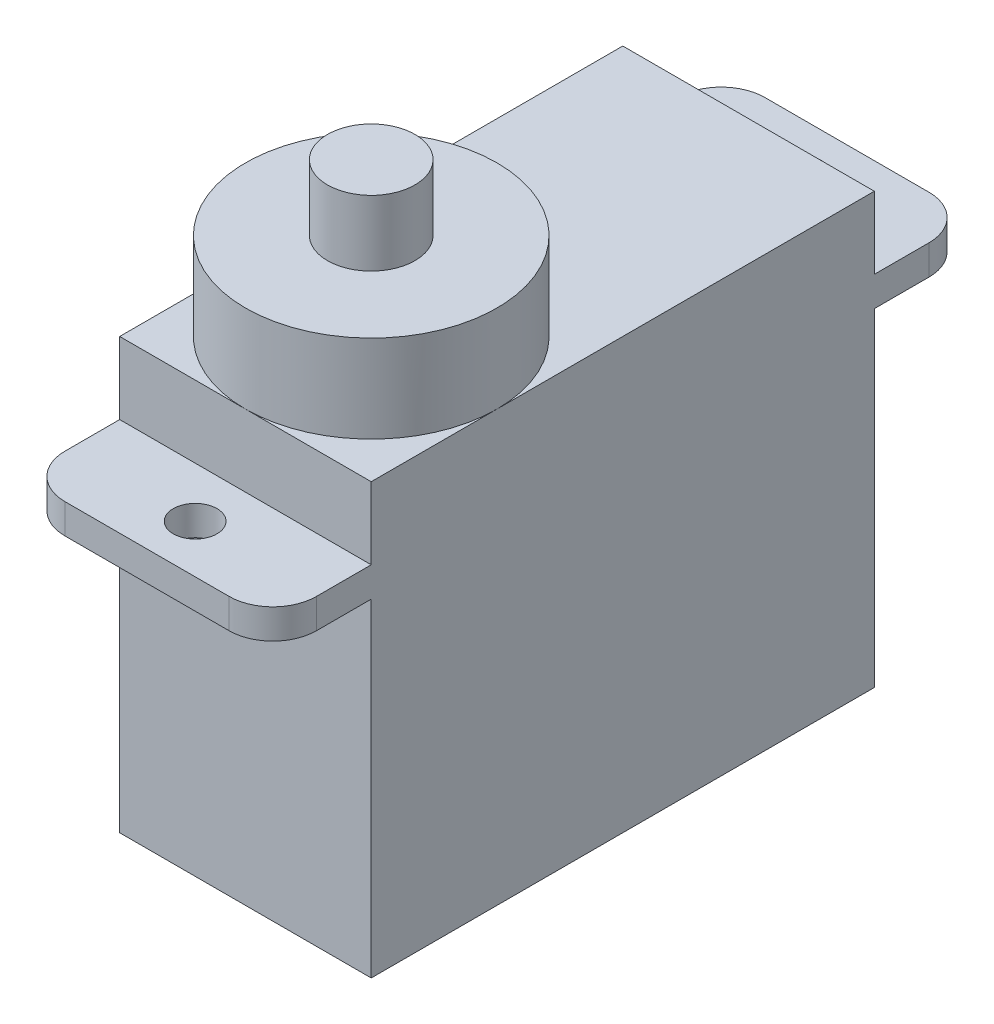
ISO-10303-21;
HEADER;
FILE_DESCRIPTION(('STEP AP214'),'2;1');
FILE_NAME('part.step','',(''),(''),'','','');
FILE_SCHEMA(('AUTOMOTIVE_DESIGN { 1 0 10303 214 1 1 1 1 }'));
ENDSEC;
DATA;
#1=APPLICATION_CONTEXT('core data for automotive mechanical design processes');
#2=APPLICATION_PROTOCOL_DEFINITION('international standard','automotive_design',2000,#1);
#3=PRODUCT_CONTEXT('',#1,'mechanical');
#4=PRODUCT('Part','Part','',(#3));
#5=PRODUCT_RELATED_PRODUCT_CATEGORY('part','',(#4));
#6=PRODUCT_DEFINITION_FORMATION('','',#4);
#7=PRODUCT_DEFINITION_CONTEXT('part definition',#1,'design');
#8=PRODUCT_DEFINITION('design','',#6,#7);
#9=PRODUCT_DEFINITION_SHAPE('','',#8);
#10=(LENGTH_UNIT() NAMED_UNIT(*) SI_UNIT(.MILLI.,.METRE.));
#11=(NAMED_UNIT(*) PLANE_ANGLE_UNIT() SI_UNIT($,.RADIAN.));
#12=(NAMED_UNIT(*) SI_UNIT($,.STERADIAN.) SOLID_ANGLE_UNIT());
#13=UNCERTAINTY_MEASURE_WITH_UNIT(LENGTH_MEASURE(1.E-05),#10,'distance_accuracy_value','');
#14=(GEOMETRIC_REPRESENTATION_CONTEXT(3) GLOBAL_UNCERTAINTY_ASSIGNED_CONTEXT((#13)) GLOBAL_UNIT_ASSIGNED_CONTEXT((#10,
#11,#12)) REPRESENTATION_CONTEXT('',''));
#15=CARTESIAN_POINT('',(0.,0.,0.));
#16=DIRECTION('',(0.,0.,1.));
#17=DIRECTION('',(1.,0.,0.));
#18=AXIS2_PLACEMENT_3D('',#15,#16,#17);
#19=CARTESIAN_POINT('',(0.,23.65,5.75));
#20=DIRECTION('',(0.,1.,0.));
#21=DIRECTION('',(0.,0.,1.));
#22=AXIS2_PLACEMENT_3D('',#19,#20,#21);
#23=PLANE('',#22);
#24=CARTESIAN_POINT('',(0.,23.65,5.75));
#25=DIRECTION('',(0.,1.,0.));
#26=DIRECTION('',(0.,0.,1.));
#27=AXIS2_PLACEMENT_3D('',#24,#25,#26);
#28=CIRCLE('',#27,5.75);
#29=CARTESIAN_POINT('',(0.,23.65,11.5));
#30=VERTEX_POINT('',#29);
#31=EDGE_CURVE('E180',#30,#30,#28,.T.);
#32=ORIENTED_EDGE('',*,*,#31,.T.);
#33=EDGE_LOOP('',(#32));
#34=FACE_BOUND('',#33,.T.);
#35=CARTESIAN_POINT('',(0.,23.65,5.75));
#36=DIRECTION('',(0.,1.,0.));
#37=DIRECTION('',(0.,0.,1.));
#38=AXIS2_PLACEMENT_3D('',#35,#36,#37);
#39=CIRCLE('',#38,2.);
#40=CARTESIAN_POINT('',(0.,23.65,7.75));
#41=VERTEX_POINT('',#40);
#42=EDGE_CURVE('E594',#41,#41,#39,.T.);
#43=ORIENTED_EDGE('',*,*,#42,.F.);
#44=EDGE_LOOP('',(#43));
#45=FACE_BOUND('',#44,.T.);
#46=ADVANCED_FACE('F36',(#34,#45),#23,.T.);
#47=CARTESIAN_POINT('',(0.,19.65,0.));
#48=DIRECTION('',(0.,1.,0.));
#49=DIRECTION('',(0.,0.,1.));
#50=AXIS2_PLACEMENT_3D('',#47,#48,#49);
#51=PLANE('',#50);
#52=CARTESIAN_POINT('',(0.,19.65,5.75));
#53=DIRECTION('',(0.,1.,0.));
#54=DIRECTION('',(0.,0.,1.));
#55=AXIS2_PLACEMENT_3D('',#52,#53,#54);
#56=CIRCLE('',#55,5.75);
#57=CARTESIAN_POINT('',(0.,19.65,11.5));
#58=VERTEX_POINT('',#57);
#59=CARTESIAN_POINT('',(5.75,19.65,5.75));
#60=VERTEX_POINT('',#59);
#61=EDGE_CURVE('E47',#58,#60,#56,.T.);
#62=ORIENTED_EDGE('',*,*,#61,.F.);
#63=DIRECTION('',(1.,0.,0.));
#64=VECTOR('',#63,1.);
#65=CARTESIAN_POINT('',(-5.75,19.65,11.5));
#66=LINE('',#65,#64);
#67=CARTESIAN_POINT('',(5.75,19.65,11.5));
#68=VERTEX_POINT('',#67);
#69=EDGE_CURVE('E165',#58,#68,#66,.T.);
#70=ORIENTED_EDGE('',*,*,#69,.T.);
#71=DIRECTION('',(0.,0.,-1.));
#72=VECTOR('',#71,1.);
#73=CARTESIAN_POINT('',(5.75,19.65,-11.5));
#74=LINE('',#73,#72);
#75=EDGE_CURVE('E178',#68,#60,#74,.T.);
#76=ORIENTED_EDGE('',*,*,#75,.T.);
#77=EDGE_LOOP('',(#62,#70,#76));
#78=FACE_BOUND('',#77,.T.);
#79=ADVANCED_FACE('F177',(#78),#51,.T.);
#80=CARTESIAN_POINT('',(-5.75,19.65,5.75));
#81=VERTEX_POINT('',#80);
#82=EDGE_CURVE('E11',#60,#81,#56,.T.);
#83=ORIENTED_EDGE('',*,*,#82,.F.);
#84=CARTESIAN_POINT('',(5.75,19.65,-11.5));
#85=VERTEX_POINT('',#84);
#86=EDGE_CURVE('E229',#60,#85,#74,.T.);
#87=ORIENTED_EDGE('',*,*,#86,.T.);
#88=DIRECTION('',(-1.,0.,0.));
#89=VECTOR('',#88,1.);
#90=CARTESIAN_POINT('',(-5.75,19.65,-11.5));
#91=LINE('',#90,#89);
#92=CARTESIAN_POINT('',(-5.75,19.65,-11.5));
#93=VERTEX_POINT('',#92);
#94=EDGE_CURVE('E228',#85,#93,#91,.T.);
#95=ORIENTED_EDGE('',*,*,#94,.T.);
#96=DIRECTION('',(0.,0.,1.));
#97=VECTOR('',#96,1.);
#98=CARTESIAN_POINT('',(-5.75,19.65,-11.5));
#99=LINE('',#98,#97);
#100=EDGE_CURVE('E175',#93,#81,#99,.T.);
#101=ORIENTED_EDGE('',*,*,#100,.T.);
#102=EDGE_LOOP('',(#83,#87,#95,#101));
#103=FACE_BOUND('',#102,.T.);
#104=ADVANCED_FACE('F366',(#103),#51,.T.);
#105=CARTESIAN_POINT('',(-5.75,19.65,-11.5));
#106=DIRECTION('',(0.,0.,1.));
#107=DIRECTION('',(1.,0.,0.));
#108=AXIS2_PLACEMENT_3D('',#105,#106,#107);
#109=PLANE('',#108);
#110=DIRECTION('',(-1.,0.,0.));
#111=VECTOR('',#110,1.);
#112=CARTESIAN_POINT('',(-5.75,15.,-11.5));
#113=LINE('',#112,#111);
#114=CARTESIAN_POINT('',(5.75,15.,-11.5));
#115=VERTEX_POINT('',#114);
#116=CARTESIAN_POINT('',(-5.75,15.,-11.5));
#117=VERTEX_POINT('',#116);
#118=EDGE_CURVE('E210',#115,#117,#113,.T.);
#119=ORIENTED_EDGE('',*,*,#118,.F.);
#120=DIRECTION('',(0.,-1.,0.));
#121=VECTOR('',#120,1.);
#122=CARTESIAN_POINT('',(5.75,19.65,-11.5));
#123=LINE('',#122,#121);
#124=CARTESIAN_POINT('',(5.75,0.,-11.5));
#125=VERTEX_POINT('',#124);
#126=EDGE_CURVE('E251',#115,#125,#123,.T.);
#127=ORIENTED_EDGE('',*,*,#126,.T.);
#128=DIRECTION('',(-1.,0.,0.));
#129=VECTOR('',#128,1.);
#130=CARTESIAN_POINT('',(-5.75,0.,-11.5));
#131=LINE('',#130,#129);
#132=CARTESIAN_POINT('',(-5.75,0.,-11.5));
#133=VERTEX_POINT('',#132);
#134=EDGE_CURVE('E234',#125,#133,#131,.T.);
#135=ORIENTED_EDGE('',*,*,#134,.T.);
#136=DIRECTION('',(0.,-1.,0.));
#137=VECTOR('',#136,1.);
#138=CARTESIAN_POINT('',(-5.75,19.65,-11.5));
#139=LINE('',#138,#137);
#140=EDGE_CURVE('E247',#117,#133,#139,.T.);
#141=ORIENTED_EDGE('',*,*,#140,.F.);
#142=EDGE_LOOP('',(#119,#127,#135,#141));
#143=FACE_BOUND('',#142,.T.);
#144=ADVANCED_FACE('F336',(#143),#109,.F.);
#145=CARTESIAN_POINT('',(-5.75,19.65,11.5));
#146=DIRECTION('',(0.,0.,-1.));
#147=DIRECTION('',(-1.,0.,0.));
#148=AXIS2_PLACEMENT_3D('',#145,#146,#147);
#149=PLANE('',#148);
#150=DIRECTION('',(1.,0.,0.));
#151=VECTOR('',#150,1.);
#152=CARTESIAN_POINT('',(-5.75,15.,11.5));
#153=LINE('',#152,#151);
#154=CARTESIAN_POINT('',(-5.75,15.,11.5));
#155=VERTEX_POINT('',#154);
#156=CARTESIAN_POINT('',(5.75,15.,11.5));
#157=VERTEX_POINT('',#156);
#158=EDGE_CURVE('E255',#155,#157,#153,.T.);
#159=ORIENTED_EDGE('',*,*,#158,.F.);
#160=DIRECTION('',(0.,-1.,0.));
#161=VECTOR('',#160,1.);
#162=CARTESIAN_POINT('',(-5.75,19.65,11.5));
#163=LINE('',#162,#161);
#164=CARTESIAN_POINT('',(-5.75,0.,11.5));
#165=VERTEX_POINT('',#164);
#166=EDGE_CURVE('E244',#155,#165,#163,.T.);
#167=ORIENTED_EDGE('',*,*,#166,.T.);
#168=DIRECTION('',(1.,0.,0.));
#169=VECTOR('',#168,1.);
#170=CARTESIAN_POINT('',(-5.75,0.,11.5));
#171=LINE('',#170,#169);
#172=CARTESIAN_POINT('',(5.75,0.,11.5));
#173=VERTEX_POINT('',#172);
#174=EDGE_CURVE('E240',#165,#173,#171,.T.);
#175=ORIENTED_EDGE('',*,*,#174,.T.);
#176=DIRECTION('',(0.,-1.,0.));
#177=VECTOR('',#176,1.);
#178=CARTESIAN_POINT('',(5.75,19.65,11.5));
#179=LINE('',#178,#177);
#180=EDGE_CURVE('E164',#157,#173,#179,.T.);
#181=ORIENTED_EDGE('',*,*,#180,.F.);
#182=EDGE_LOOP('',(#159,#167,#175,#181));
#183=FACE_BOUND('',#182,.T.);
#184=ADVANCED_FACE('F328',(#183),#149,.F.);
#185=CARTESIAN_POINT('',(5.75,19.65,-11.5));
#186=DIRECTION('',(-1.,0.,0.));
#187=DIRECTION('',(0.,0.,1.));
#188=AXIS2_PLACEMENT_3D('',#185,#186,#187);
#189=PLANE('',#188);
#190=DIRECTION('',(0.,0.,1.));
#191=VECTOR('',#190,1.);
#192=CARTESIAN_POINT('',(5.75,15.,16.));
#193=LINE('',#192,#191);
#194=CARTESIAN_POINT('',(5.75,15.,-14.));
#195=VERTEX_POINT('',#194);
#196=EDGE_CURVE('E217',#195,#115,#193,.T.);
#197=ORIENTED_EDGE('',*,*,#196,.F.);
#198=DIRECTION('',(0.,-1.,0.));
#199=VECTOR('',#198,1.);
#200=CARTESIAN_POINT('',(5.75,16.36,-14.));
#201=LINE('',#200,#199);
#202=CARTESIAN_POINT('',(5.75,16.36,-14.));
#203=VERTEX_POINT('',#202);
#204=EDGE_CURVE('E283',#195,#203,#201,.F.);
#205=ORIENTED_EDGE('',*,*,#204,.T.);
#206=DIRECTION('',(0.,0.,1.));
#207=VECTOR('',#206,1.);
#208=CARTESIAN_POINT('',(5.75,16.36,16.));
#209=LINE('',#208,#207);
#210=CARTESIAN_POINT('',(5.75,16.36,-11.5));
#211=VERTEX_POINT('',#210);
#212=EDGE_CURVE('E205',#203,#211,#209,.T.);
#213=ORIENTED_EDGE('',*,*,#212,.T.);
#214=EDGE_CURVE('E252',#85,#211,#123,.T.);
#215=ORIENTED_EDGE('',*,*,#214,.F.);
#216=ORIENTED_EDGE('',*,*,#86,.F.);
#217=ORIENTED_EDGE('',*,*,#75,.F.);
#218=CARTESIAN_POINT('',(5.75,16.36,11.5));
#219=VERTEX_POINT('',#218);
#220=EDGE_CURVE('E171',#68,#219,#179,.T.);
#221=ORIENTED_EDGE('',*,*,#220,.T.);
#222=CARTESIAN_POINT('',(5.75,16.36,14.));
#223=VERTEX_POINT('',#222);
#224=EDGE_CURVE('E204',#219,#223,#209,.T.);
#225=ORIENTED_EDGE('',*,*,#224,.T.);
#226=DIRECTION('',(0.,-1.,0.));
#227=VECTOR('',#226,1.);
#228=CARTESIAN_POINT('',(5.75,15.,14.));
#229=LINE('',#228,#227);
#230=CARTESIAN_POINT('',(5.75,15.,14.));
#231=VERTEX_POINT('',#230);
#232=EDGE_CURVE('E280',#223,#231,#229,.T.);
#233=ORIENTED_EDGE('',*,*,#232,.T.);
#234=EDGE_CURVE('E216',#157,#231,#193,.T.);
#235=ORIENTED_EDGE('',*,*,#234,.F.);
#236=ORIENTED_EDGE('',*,*,#180,.T.);
#237=DIRECTION('',(0.,0.,-1.));
#238=VECTOR('',#237,1.);
#239=CARTESIAN_POINT('',(5.75,0.,-11.5));
#240=LINE('',#239,#238);
#241=EDGE_CURVE('E226',#173,#125,#240,.T.);
#242=ORIENTED_EDGE('',*,*,#241,.T.);
#243=ORIENTED_EDGE('',*,*,#126,.F.);
#244=EDGE_LOOP('',(#197,#205,#213,#215,#216,#217,#221,#225,#233,#235,#236,#242,#243));
#245=FACE_BOUND('',#244,.T.);
#246=ADVANCED_FACE('F306',(#245),#189,.F.);
#247=ORIENTED_EDGE('',*,*,#214,.T.);
#248=DIRECTION('',(-1.,0.,0.));
#249=VECTOR('',#248,1.);
#250=CARTESIAN_POINT('',(-5.75,16.36,-11.5));
#251=LINE('',#250,#249);
#252=CARTESIAN_POINT('',(-5.75,16.36,-11.5));
#253=VERTEX_POINT('',#252);
#254=EDGE_CURVE('E224',#211,#253,#251,.T.);
#255=ORIENTED_EDGE('',*,*,#254,.T.);
#256=EDGE_CURVE('E248',#93,#253,#139,.T.);
#257=ORIENTED_EDGE('',*,*,#256,.F.);
#258=ORIENTED_EDGE('',*,*,#94,.F.);
#259=EDGE_LOOP('',(#247,#255,#257,#258));
#260=FACE_BOUND('',#259,.T.);
#261=ADVANCED_FACE('F363',(#260),#109,.F.);
#262=CARTESIAN_POINT('',(-5.75,19.65,-11.5));
#263=DIRECTION('',(1.,0.,0.));
#264=DIRECTION('',(0.,0.,-1.));
#265=AXIS2_PLACEMENT_3D('',#262,#263,#264);
#266=PLANE('',#265);
#267=DIRECTION('',(0.,0.,-1.));
#268=VECTOR('',#267,1.);
#269=CARTESIAN_POINT('',(-5.75,16.36,16.));
#270=LINE('',#269,#268);
#271=CARTESIAN_POINT('',(-5.75,16.36,-14.));
#272=VERTEX_POINT('',#271);
#273=EDGE_CURVE('E201',#253,#272,#270,.T.);
#274=ORIENTED_EDGE('',*,*,#273,.T.);
#275=DIRECTION('',(0.,-1.,0.));
#276=VECTOR('',#275,1.);
#277=CARTESIAN_POINT('',(-5.75,15.,-14.));
#278=LINE('',#277,#276);
#279=CARTESIAN_POINT('',(-5.75,15.,-14.));
#280=VERTEX_POINT('',#279);
#281=EDGE_CURVE('E264',#272,#280,#278,.T.);
#282=ORIENTED_EDGE('',*,*,#281,.T.);
#283=DIRECTION('',(0.,0.,-1.));
#284=VECTOR('',#283,1.);
#285=CARTESIAN_POINT('',(-5.75,15.,16.));
#286=LINE('',#285,#284);
#287=EDGE_CURVE('E197',#117,#280,#286,.T.);
#288=ORIENTED_EDGE('',*,*,#287,.F.);
#289=ORIENTED_EDGE('',*,*,#140,.T.);
#290=DIRECTION('',(0.,0.,1.));
#291=VECTOR('',#290,1.);
#292=CARTESIAN_POINT('',(-5.75,0.,-11.5));
#293=LINE('',#292,#291);
#294=EDGE_CURVE('E237',#133,#165,#293,.T.);
#295=ORIENTED_EDGE('',*,*,#294,.T.);
#296=ORIENTED_EDGE('',*,*,#166,.F.);
#297=CARTESIAN_POINT('',(-5.75,15.,14.));
#298=VERTEX_POINT('',#297);
#299=EDGE_CURVE('E211',#298,#155,#286,.T.);
#300=ORIENTED_EDGE('',*,*,#299,.F.);
#301=DIRECTION('',(0.,-1.,0.));
#302=VECTOR('',#301,1.);
#303=CARTESIAN_POINT('',(-5.75,16.36,14.));
#304=LINE('',#303,#302);
#305=CARTESIAN_POINT('',(-5.75,16.36,14.));
#306=VERTEX_POINT('',#305);
#307=EDGE_CURVE('E260',#298,#306,#304,.F.);
#308=ORIENTED_EDGE('',*,*,#307,.T.);
#309=CARTESIAN_POINT('',(-5.75,16.36,11.5));
#310=VERTEX_POINT('',#309);
#311=EDGE_CURVE('E198',#306,#310,#270,.T.);
#312=ORIENTED_EDGE('',*,*,#311,.T.);
#313=CARTESIAN_POINT('',(-5.75,19.65,11.5));
#314=VERTEX_POINT('',#313);
#315=EDGE_CURVE('E245',#314,#310,#163,.T.);
#316=ORIENTED_EDGE('',*,*,#315,.F.);
#317=EDGE_CURVE('E160',#81,#314,#99,.T.);
#318=ORIENTED_EDGE('',*,*,#317,.F.);
#319=ORIENTED_EDGE('',*,*,#100,.F.);
#320=ORIENTED_EDGE('',*,*,#256,.T.);
#321=EDGE_LOOP('',(#274,#282,#288,#289,#295,#296,#300,#308,#312,#316,#318,#319,#320));
#322=FACE_BOUND('',#321,.T.);
#323=ADVANCED_FACE('F324',(#322),#266,.F.);
#324=ORIENTED_EDGE('',*,*,#315,.T.);
#325=DIRECTION('',(1.,0.,0.));
#326=VECTOR('',#325,1.);
#327=CARTESIAN_POINT('',(-5.75,16.36,11.5));
#328=LINE('',#327,#326);
#329=EDGE_CURVE('E258',#310,#219,#328,.T.);
#330=ORIENTED_EDGE('',*,*,#329,.T.);
#331=ORIENTED_EDGE('',*,*,#220,.F.);
#332=ORIENTED_EDGE('',*,*,#69,.F.);
#333=EDGE_CURVE('E157',#314,#58,#66,.T.);
#334=ORIENTED_EDGE('',*,*,#333,.F.);
#335=EDGE_LOOP('',(#324,#330,#331,#332,#334));
#336=FACE_BOUND('',#335,.T.);
#337=ADVANCED_FACE('F169',(#336),#149,.F.);
#338=EDGE_CURVE('E45',#81,#58,#56,.T.);
#339=ORIENTED_EDGE('',*,*,#338,.F.);
#340=ORIENTED_EDGE('',*,*,#317,.T.);
#341=ORIENTED_EDGE('',*,*,#333,.T.);
#342=EDGE_LOOP('',(#339,#340,#341));
#343=FACE_BOUND('',#342,.T.);
#344=ADVANCED_FACE('F159',(#343),#51,.T.);
#345=CARTESIAN_POINT('',(0.,0.,0.));
#346=DIRECTION('',(0.,1.,0.));
#347=DIRECTION('',(0.,0.,1.));
#348=AXIS2_PLACEMENT_3D('',#345,#346,#347);
#349=PLANE('',#348);
#350=ORIENTED_EDGE('',*,*,#241,.F.);
#351=ORIENTED_EDGE('',*,*,#174,.F.);
#352=ORIENTED_EDGE('',*,*,#294,.F.);
#353=ORIENTED_EDGE('',*,*,#134,.F.);
#354=EDGE_LOOP('',(#350,#351,#352,#353));
#355=FACE_BOUND('',#354,.T.);
#356=ADVANCED_FACE('F333',(#355),#349,.F.);
#357=CARTESIAN_POINT('',(5.75,16.36,16.));
#358=DIRECTION('',(0.,0.,1.));
#359=DIRECTION('',(1.,0.,0.));
#360=AXIS2_PLACEMENT_3D('',#357,#358,#359);
#361=PLANE('',#360);
#362=DIRECTION('',(-1.,0.,0.));
#363=VECTOR('',#362,1.);
#364=CARTESIAN_POINT('',(5.75,16.36,16.));
#365=LINE('',#364,#363);
#366=CARTESIAN_POINT('',(3.75,16.36,16.));
#367=VERTEX_POINT('',#366);
#368=CARTESIAN_POINT('',(-3.75,16.36,16.));
#369=VERTEX_POINT('',#368);
#370=EDGE_CURVE('E207',#367,#369,#365,.T.);
#371=ORIENTED_EDGE('',*,*,#370,.T.);
#372=DIRECTION('',(0.,-1.,0.));
#373=VECTOR('',#372,1.);
#374=CARTESIAN_POINT('',(-3.75,15.,16.));
#375=LINE('',#374,#373);
#376=CARTESIAN_POINT('',(-3.75,15.,16.));
#377=VERTEX_POINT('',#376);
#378=EDGE_CURVE('E287',#369,#377,#375,.T.);
#379=ORIENTED_EDGE('',*,*,#378,.T.);
#380=DIRECTION('',(-1.,0.,0.));
#381=VECTOR('',#380,1.);
#382=CARTESIAN_POINT('',(5.75,15.,16.));
#383=LINE('',#382,#381);
#384=CARTESIAN_POINT('',(3.75,15.,16.));
#385=VERTEX_POINT('',#384);
#386=EDGE_CURVE('E219',#385,#377,#383,.T.);
#387=ORIENTED_EDGE('',*,*,#386,.F.);
#388=DIRECTION('',(0.,-1.,0.));
#389=VECTOR('',#388,1.);
#390=CARTESIAN_POINT('',(3.75,16.36,16.));
#391=LINE('',#390,#389);
#392=EDGE_CURVE('E285',#385,#367,#391,.F.);
#393=ORIENTED_EDGE('',*,*,#392,.T.);
#394=EDGE_LOOP('',(#371,#379,#387,#393));
#395=FACE_BOUND('',#394,.T.);
#396=ADVANCED_FACE('F313',(#395),#361,.T.);
#397=CARTESIAN_POINT('',(0.,15.,0.));
#398=DIRECTION('',(0.,1.,0.));
#399=DIRECTION('',(0.,0.,1.));
#400=AXIS2_PLACEMENT_3D('',#397,#398,#399);
#401=PLANE('',#400);
#402=CARTESIAN_POINT('',(-2.89094654856212E-13,15.,13.8));
#403=DIRECTION('',(0.,-1.,0.));
#404=DIRECTION('',(0.,0.,-1.));
#405=AXIS2_PLACEMENT_3D('',#402,#403,#404);
#406=CIRCLE('',#405,1.);
#407=CARTESIAN_POINT('',(-2.89094654856212E-13,15.,12.8));
#408=VERTEX_POINT('',#407);
#409=EDGE_CURVE('E187',#408,#408,#406,.T.);
#410=ORIENTED_EDGE('',*,*,#409,.F.);
#411=EDGE_LOOP('',(#410));
#412=FACE_BOUND('',#411,.T.);
#413=ORIENTED_EDGE('',*,*,#386,.T.);
#414=CARTESIAN_POINT('',(-3.75,15.,14.));
#415=DIRECTION('',(0.,1.,0.));
#416=DIRECTION('',(0.,0.,1.));
#417=AXIS2_PLACEMENT_3D('',#414,#415,#416);
#418=CIRCLE('',#417,2.);
#419=EDGE_CURVE('E292',#377,#298,#418,.F.);
#420=ORIENTED_EDGE('',*,*,#419,.T.);
#421=ORIENTED_EDGE('',*,*,#299,.T.);
#422=ORIENTED_EDGE('',*,*,#158,.T.);
#423=ORIENTED_EDGE('',*,*,#234,.T.);
#424=CARTESIAN_POINT('',(3.75,15.,14.));
#425=DIRECTION('',(0.,1.,0.));
#426=DIRECTION('',(0.,0.,1.));
#427=AXIS2_PLACEMENT_3D('',#424,#425,#426);
#428=CIRCLE('',#427,2.);
#429=EDGE_CURVE('E290',#231,#385,#428,.F.);
#430=ORIENTED_EDGE('',*,*,#429,.T.);
#431=EDGE_LOOP('',(#413,#420,#421,#422,#423,#430));
#432=FACE_BOUND('',#431,.T.);
#433=ADVANCED_FACE('F311',(#412,#432),#401,.F.);
#434=CARTESIAN_POINT('',(0.,16.36,0.));
#435=DIRECTION('',(0.,1.,0.));
#436=DIRECTION('',(0.,0.,1.));
#437=AXIS2_PLACEMENT_3D('',#434,#435,#436);
#438=PLANE('',#437);
#439=CARTESIAN_POINT('',(-2.89094654856212E-13,16.36,13.8));
#440=DIRECTION('',(0.,1.,0.));
#441=DIRECTION('',(0.,0.,1.));
#442=AXIS2_PLACEMENT_3D('',#439,#440,#441);
#443=CIRCLE('',#442,1.);
#444=CARTESIAN_POINT('',(-2.89094654856212E-13,16.36,14.8));
#445=VERTEX_POINT('',#444);
#446=EDGE_CURVE('E190',#445,#445,#443,.T.);
#447=ORIENTED_EDGE('',*,*,#446,.F.);
#448=EDGE_LOOP('',(#447));
#449=FACE_BOUND('',#448,.T.);
#450=ORIENTED_EDGE('',*,*,#311,.F.);
#451=CARTESIAN_POINT('',(-3.75,16.36,14.));
#452=DIRECTION('',(0.,1.,0.));
#453=DIRECTION('',(0.,0.,1.));
#454=AXIS2_PLACEMENT_3D('',#451,#452,#453);
#455=CIRCLE('',#454,2.);
#456=EDGE_CURVE('E40',#306,#369,#455,.T.);
#457=ORIENTED_EDGE('',*,*,#456,.T.);
#458=ORIENTED_EDGE('',*,*,#370,.F.);
#459=CARTESIAN_POINT('',(3.75,16.36,14.));
#460=DIRECTION('',(0.,1.,0.));
#461=DIRECTION('',(0.,0.,1.));
#462=AXIS2_PLACEMENT_3D('',#459,#460,#461);
#463=CIRCLE('',#462,2.);
#464=EDGE_CURVE('E183',#367,#223,#463,.T.);
#465=ORIENTED_EDGE('',*,*,#464,.T.);
#466=ORIENTED_EDGE('',*,*,#224,.F.);
#467=ORIENTED_EDGE('',*,*,#329,.F.);
#468=EDGE_LOOP('',(#450,#457,#458,#465,#466,#467));
#469=FACE_BOUND('',#468,.T.);
#470=ADVANCED_FACE('F299',(#449,#469),#438,.T.);
#471=CARTESIAN_POINT('',(0.,16.36,-13.8));
#472=DIRECTION('',(0.,1.,0.));
#473=DIRECTION('',(0.,0.,1.));
#474=AXIS2_PLACEMENT_3D('',#471,#472,#473);
#475=CIRCLE('',#474,1.);
#476=CARTESIAN_POINT('',(0.,16.36,-12.8));
#477=VERTEX_POINT('',#476);
#478=EDGE_CURVE('E194',#477,#477,#475,.T.);
#479=ORIENTED_EDGE('',*,*,#478,.F.);
#480=EDGE_LOOP('',(#479));
#481=FACE_BOUND('',#480,.T.);
#482=DIRECTION('',(1.,0.,0.));
#483=VECTOR('',#482,1.);
#484=CARTESIAN_POINT('',(5.75,16.36,-16.));
#485=LINE('',#484,#483);
#486=CARTESIAN_POINT('',(-3.75,16.36,-16.));
#487=VERTEX_POINT('',#486);
#488=CARTESIAN_POINT('',(3.75,16.36,-16.));
#489=VERTEX_POINT('',#488);
#490=EDGE_CURVE('E200',#487,#489,#485,.T.);
#491=ORIENTED_EDGE('',*,*,#490,.F.);
#492=CARTESIAN_POINT('',(-3.75,16.36,-14.));
#493=DIRECTION('',(0.,1.,0.));
#494=DIRECTION('',(0.,0.,1.));
#495=AXIS2_PLACEMENT_3D('',#492,#493,#494);
#496=CIRCLE('',#495,2.);
#497=EDGE_CURVE('E278',#487,#272,#496,.T.);
#498=ORIENTED_EDGE('',*,*,#497,.T.);
#499=ORIENTED_EDGE('',*,*,#273,.F.);
#500=ORIENTED_EDGE('',*,*,#254,.F.);
#501=ORIENTED_EDGE('',*,*,#212,.F.);
#502=CARTESIAN_POINT('',(3.75,16.36,-14.));
#503=DIRECTION('',(0.,1.,0.));
#504=DIRECTION('',(0.,0.,1.));
#505=AXIS2_PLACEMENT_3D('',#502,#503,#504);
#506=CIRCLE('',#505,2.);
#507=EDGE_CURVE('E276',#203,#489,#506,.T.);
#508=ORIENTED_EDGE('',*,*,#507,.T.);
#509=EDGE_LOOP('',(#491,#498,#499,#500,#501,#508));
#510=FACE_BOUND('',#509,.T.);
#511=ADVANCED_FACE('F360',(#481,#510),#438,.T.);
#512=CARTESIAN_POINT('',(0.,15.,-13.8));
#513=DIRECTION('',(0.,-1.,0.));
#514=DIRECTION('',(0.,0.,-1.));
#515=AXIS2_PLACEMENT_3D('',#512,#513,#514);
#516=CIRCLE('',#515,1.);
#517=CARTESIAN_POINT('',(0.,15.,-14.8));
#518=VERTEX_POINT('',#517);
#519=EDGE_CURVE('E191',#518,#518,#516,.T.);
#520=ORIENTED_EDGE('',*,*,#519,.F.);
#521=EDGE_LOOP('',(#520));
#522=FACE_BOUND('',#521,.T.);
#523=ORIENTED_EDGE('',*,*,#287,.T.);
#524=CARTESIAN_POINT('',(-3.75,15.,-14.));
#525=DIRECTION('',(0.,1.,0.));
#526=DIRECTION('',(0.,0.,1.));
#527=AXIS2_PLACEMENT_3D('',#524,#525,#526);
#528=CIRCLE('',#527,2.);
#529=CARTESIAN_POINT('',(-3.75,15.,-16.));
#530=VERTEX_POINT('',#529);
#531=EDGE_CURVE('E269',#280,#530,#528,.F.);
#532=ORIENTED_EDGE('',*,*,#531,.T.);
#533=DIRECTION('',(1.,0.,0.));
#534=VECTOR('',#533,1.);
#535=CARTESIAN_POINT('',(5.75,15.,-16.));
#536=LINE('',#535,#534);
#537=CARTESIAN_POINT('',(3.75,15.,-16.));
#538=VERTEX_POINT('',#537);
#539=EDGE_CURVE('E213',#530,#538,#536,.T.);
#540=ORIENTED_EDGE('',*,*,#539,.T.);
#541=CARTESIAN_POINT('',(3.75,15.,-14.));
#542=DIRECTION('',(0.,1.,0.));
#543=DIRECTION('',(0.,0.,1.));
#544=AXIS2_PLACEMENT_3D('',#541,#542,#543);
#545=CIRCLE('',#544,2.);
#546=EDGE_CURVE('E267',#538,#195,#545,.F.);
#547=ORIENTED_EDGE('',*,*,#546,.T.);
#548=ORIENTED_EDGE('',*,*,#196,.T.);
#549=ORIENTED_EDGE('',*,*,#118,.T.);
#550=EDGE_LOOP('',(#523,#532,#540,#547,#548,#549));
#551=FACE_BOUND('',#550,.T.);
#552=ADVANCED_FACE('F340',(#522,#551),#401,.F.);
#553=CARTESIAN_POINT('',(5.75,16.36,-16.));
#554=DIRECTION('',(0.,0.,-1.));
#555=DIRECTION('',(-1.,0.,0.));
#556=AXIS2_PLACEMENT_3D('',#553,#554,#555);
#557=PLANE('',#556);
#558=ORIENTED_EDGE('',*,*,#539,.F.);
#559=DIRECTION('',(0.,-1.,0.));
#560=VECTOR('',#559,1.);
#561=CARTESIAN_POINT('',(-3.75,16.36,-16.));
#562=LINE('',#561,#560);
#563=EDGE_CURVE('E274',#530,#487,#562,.F.);
#564=ORIENTED_EDGE('',*,*,#563,.T.);
#565=ORIENTED_EDGE('',*,*,#490,.T.);
#566=DIRECTION('',(0.,-1.,0.));
#567=VECTOR('',#566,1.);
#568=CARTESIAN_POINT('',(3.75,15.,-16.));
#569=LINE('',#568,#567);
#570=EDGE_CURVE('E271',#489,#538,#569,.T.);
#571=ORIENTED_EDGE('',*,*,#570,.T.);
#572=EDGE_LOOP('',(#558,#564,#565,#571));
#573=FACE_BOUND('',#572,.T.);
#574=ADVANCED_FACE('F349',(#573),#557,.T.);
#575=CARTESIAN_POINT('',(0.,20.,-13.8));
#576=DIRECTION('',(0.,-1.,0.));
#577=DIRECTION('',(0.,0.,-1.));
#578=AXIS2_PLACEMENT_3D('',#575,#576,#577);
#579=CYLINDRICAL_SURFACE('',#578,1.);
#580=ORIENTED_EDGE('',*,*,#478,.T.);
#581=EDGE_LOOP('',(#580));
#582=FACE_BOUND('',#581,.T.);
#583=ORIENTED_EDGE('',*,*,#519,.T.);
#584=EDGE_LOOP('',(#583));
#585=FACE_BOUND('',#584,.T.);
#586=ADVANCED_FACE('F394',(#582,#585),#579,.F.);
#587=CARTESIAN_POINT('',(-2.89094654856212E-13,20.,13.8));
#588=DIRECTION('',(0.,-1.,0.));
#589=DIRECTION('',(0.,0.,-1.));
#590=AXIS2_PLACEMENT_3D('',#587,#588,#589);
#591=CYLINDRICAL_SURFACE('',#590,1.);
#592=ORIENTED_EDGE('',*,*,#446,.T.);
#593=EDGE_LOOP('',(#592));
#594=FACE_BOUND('',#593,.T.);
#595=ORIENTED_EDGE('',*,*,#409,.T.);
#596=EDGE_LOOP('',(#595));
#597=FACE_BOUND('',#596,.T.);
#598=ADVANCED_FACE('F391',(#594,#597),#591,.F.);
#599=CARTESIAN_POINT('',(-3.75,19.65,-14.));
#600=DIRECTION('',(0.,1.,0.));
#601=DIRECTION('',(0.,0.,1.));
#602=AXIS2_PLACEMENT_3D('',#599,#600,#601);
#603=CYLINDRICAL_SURFACE('',#602,2.);
#604=ORIENTED_EDGE('',*,*,#497,.F.);
#605=ORIENTED_EDGE('',*,*,#563,.F.);
#606=ORIENTED_EDGE('',*,*,#531,.F.);
#607=ORIENTED_EDGE('',*,*,#281,.F.);
#608=EDGE_LOOP('',(#604,#605,#606,#607));
#609=FACE_BOUND('',#608,.T.);
#610=ADVANCED_FACE('F345',(#609),#603,.T.);
#611=CARTESIAN_POINT('',(3.75,16.36,-14.));
#612=DIRECTION('',(0.,1.,0.));
#613=DIRECTION('',(0.,0.,1.));
#614=AXIS2_PLACEMENT_3D('',#611,#612,#613);
#615=CYLINDRICAL_SURFACE('',#614,2.);
#616=ORIENTED_EDGE('',*,*,#507,.F.);
#617=ORIENTED_EDGE('',*,*,#204,.F.);
#618=ORIENTED_EDGE('',*,*,#546,.F.);
#619=ORIENTED_EDGE('',*,*,#570,.F.);
#620=EDGE_LOOP('',(#616,#617,#618,#619));
#621=FACE_BOUND('',#620,.T.);
#622=ADVANCED_FACE('F354',(#621),#615,.T.);
#623=CARTESIAN_POINT('',(-3.75,16.36,14.));
#624=DIRECTION('',(0.,1.,0.));
#625=DIRECTION('',(0.,0.,1.));
#626=AXIS2_PLACEMENT_3D('',#623,#624,#625);
#627=CYLINDRICAL_SURFACE('',#626,2.);
#628=ORIENTED_EDGE('',*,*,#456,.F.);
#629=ORIENTED_EDGE('',*,*,#307,.F.);
#630=ORIENTED_EDGE('',*,*,#419,.F.);
#631=ORIENTED_EDGE('',*,*,#378,.F.);
#632=EDGE_LOOP('',(#628,#629,#630,#631));
#633=FACE_BOUND('',#632,.T.);
#634=ADVANCED_FACE('F317',(#633),#627,.T.);
#635=CARTESIAN_POINT('',(3.75,19.65,14.));
#636=DIRECTION('',(0.,1.,0.));
#637=DIRECTION('',(0.,0.,1.));
#638=AXIS2_PLACEMENT_3D('',#635,#636,#637);
#639=CYLINDRICAL_SURFACE('',#638,2.);
#640=ORIENTED_EDGE('',*,*,#464,.F.);
#641=ORIENTED_EDGE('',*,*,#392,.F.);
#642=ORIENTED_EDGE('',*,*,#429,.F.);
#643=ORIENTED_EDGE('',*,*,#232,.F.);
#644=EDGE_LOOP('',(#640,#641,#642,#643));
#645=FACE_BOUND('',#644,.T.);
#646=ADVANCED_FACE('F38',(#645),#639,.T.);
#647=CARTESIAN_POINT('',(0.,23.65,5.75));
#648=DIRECTION('',(0.,-1.,0.));
#649=DIRECTION('',(0.,0.,-1.));
#650=AXIS2_PLACEMENT_3D('',#647,#648,#649);
#651=CYLINDRICAL_SURFACE('',#650,5.75);
#652=ORIENTED_EDGE('',*,*,#31,.F.);
#653=EDGE_LOOP('',(#652));
#654=FACE_BOUND('',#653,.T.);
#655=ORIENTED_EDGE('',*,*,#61,.T.);
#656=ORIENTED_EDGE('',*,*,#82,.T.);
#657=ORIENTED_EDGE('',*,*,#338,.T.);
#658=EDGE_LOOP('',(#655,#656,#657));
#659=FACE_BOUND('',#658,.T.);
#660=ADVANCED_FACE('F182',(#654,#659),#651,.T.);
#661=CARTESIAN_POINT('',(0.,26.65,5.75));
#662=DIRECTION('',(0.,-1.,0.));
#663=DIRECTION('',(0.,0.,-1.));
#664=AXIS2_PLACEMENT_3D('',#661,#662,#663);
#665=CYLINDRICAL_SURFACE('',#664,2.);
#666=CARTESIAN_POINT('',(0.,26.65,5.75));
#667=DIRECTION('',(0.,1.,0.));
#668=DIRECTION('',(0.,0.,1.));
#669=AXIS2_PLACEMENT_3D('',#666,#667,#668);
#670=CIRCLE('',#669,2.);
#671=CARTESIAN_POINT('',(0.,26.65,7.75));
#672=VERTEX_POINT('',#671);
#673=EDGE_CURVE('E181',#672,#672,#670,.T.);
#674=ORIENTED_EDGE('',*,*,#673,.F.);
#675=EDGE_LOOP('',(#674));
#676=FACE_BOUND('',#675,.T.);
#677=ORIENTED_EDGE('',*,*,#42,.T.);
#678=EDGE_LOOP('',(#677));
#679=FACE_BOUND('',#678,.T.);
#680=ADVANCED_FACE('F386',(#676,#679),#665,.T.);
#681=CARTESIAN_POINT('',(0.,26.65,5.75));
#682=DIRECTION('',(0.,1.,0.));
#683=DIRECTION('',(0.,0.,1.));
#684=AXIS2_PLACEMENT_3D('',#681,#682,#683);
#685=PLANE('',#684);
#686=ORIENTED_EDGE('',*,*,#673,.T.);
#687=EDGE_LOOP('',(#686));
#688=FACE_BOUND('',#687,.T.);
#689=ADVANCED_FACE('F455',(#688),#685,.T.);
#690=CLOSED_SHELL('',(#46,#79,#104,#144,#184,#246,#261,#323,#337,#344,#356,#396,#433,#470,#511,
#552,#574,#586,#598,#610,#622,#634,#646,#660,#680,#689));
#691=MANIFOLD_SOLID_BREP('B2',#690);
#692=ADVANCED_BREP_SHAPE_REPRESENTATION('',(#18,#691),#14);
#693=SHAPE_DEFINITION_REPRESENTATION(#9,#692);
ENDSEC;
END-ISO-10303-21;
